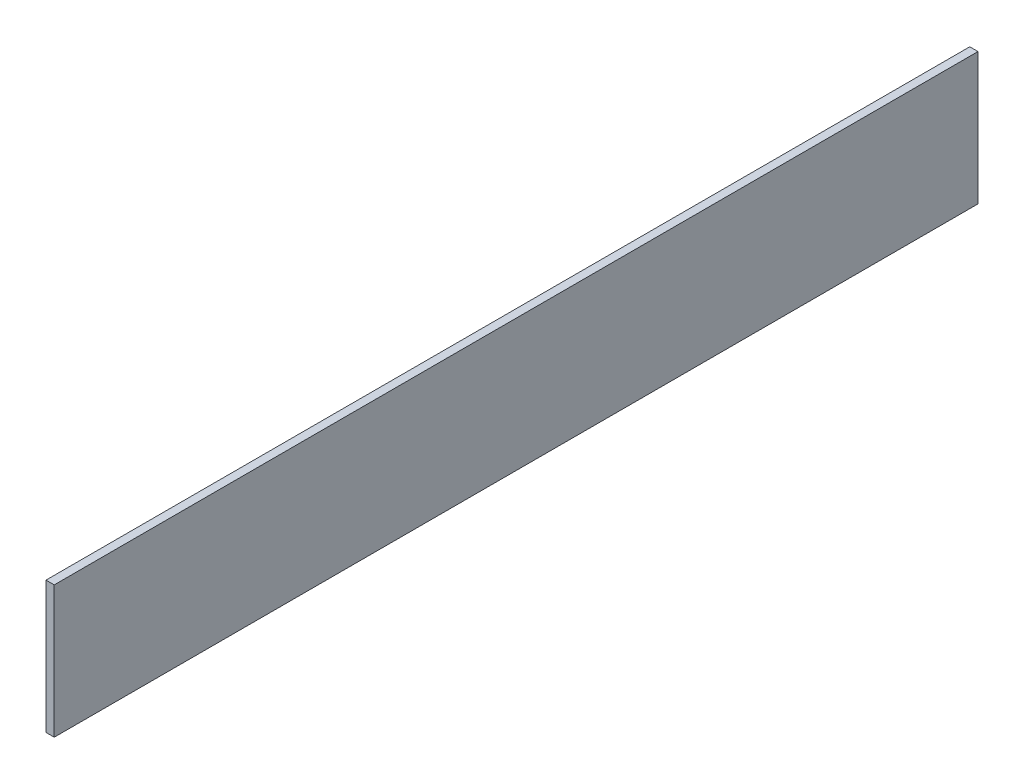
ISO-10303-21;
HEADER;
FILE_DESCRIPTION(('STEP AP214'),'2;1');
FILE_NAME('part.step','',(''),(''),'','','');
FILE_SCHEMA(('AUTOMOTIVE_DESIGN { 1 0 10303 214 1 1 1 1 }'));
ENDSEC;
DATA;
#1=APPLICATION_CONTEXT('core data for automotive mechanical design processes');
#2=APPLICATION_PROTOCOL_DEFINITION('international standard','automotive_design',2000,#1);
#3=PRODUCT_CONTEXT('',#1,'mechanical');
#4=PRODUCT('Part','Part','',(#3));
#5=PRODUCT_RELATED_PRODUCT_CATEGORY('part','',(#4));
#6=PRODUCT_DEFINITION_FORMATION('','',#4);
#7=PRODUCT_DEFINITION_CONTEXT('part definition',#1,'design');
#8=PRODUCT_DEFINITION('design','',#6,#7);
#9=PRODUCT_DEFINITION_SHAPE('','',#8);
#10=(LENGTH_UNIT() NAMED_UNIT(*) SI_UNIT(.MILLI.,.METRE.));
#11=(NAMED_UNIT(*) PLANE_ANGLE_UNIT() SI_UNIT($,.RADIAN.));
#12=(NAMED_UNIT(*) SI_UNIT($,.STERADIAN.) SOLID_ANGLE_UNIT());
#13=UNCERTAINTY_MEASURE_WITH_UNIT(LENGTH_MEASURE(1.E-05),#10,'distance_accuracy_value','');
#14=(GEOMETRIC_REPRESENTATION_CONTEXT(3) GLOBAL_UNCERTAINTY_ASSIGNED_CONTEXT((#13)) GLOBAL_UNIT_ASSIGNED_CONTEXT((#10,
#11,#12)) REPRESENTATION_CONTEXT('',''));
#15=CARTESIAN_POINT('',(0.,0.,0.));
#16=DIRECTION('',(0.,0.,1.));
#17=DIRECTION('',(1.,0.,0.));
#18=AXIS2_PLACEMENT_3D('',#15,#16,#17);
#19=CARTESIAN_POINT('',(4.7625,111.424947400933,248.712789474037));
#20=DIRECTION('',(0.,0.,-1.));
#21=DIRECTION('',(-1.,0.,0.));
#22=AXIS2_PLACEMENT_3D('',#19,#20,#21);
#23=PLANE('',#22);
#24=DIRECTION('',(0.,-1.,0.));
#25=VECTOR('',#24,1.);
#26=CARTESIAN_POINT('',(0.,111.424947400933,248.712789474037));
#27=LINE('',#26,#25);
#28=CARTESIAN_POINT('',(0.,187.624947400933,248.712789474037));
#29=VERTEX_POINT('',#28);
#30=CARTESIAN_POINT('',(0.,111.424947400933,248.712789474037));
#31=VERTEX_POINT('',#30);
#32=EDGE_CURVE('E96',#29,#31,#27,.T.);
#33=ORIENTED_EDGE('',*,*,#32,.T.);
#34=DIRECTION('',(-1.,0.,0.));
#35=VECTOR('',#34,1.);
#36=CARTESIAN_POINT('',(4.7625,111.424947400933,248.712789474037));
#37=LINE('',#36,#35);
#38=CARTESIAN_POINT('',(4.7625,111.424947400933,248.712789474037));
#39=VERTEX_POINT('',#38);
#40=EDGE_CURVE('E11',#39,#31,#37,.T.);
#41=ORIENTED_EDGE('',*,*,#40,.F.);
#42=DIRECTION('',(0.,-1.,0.));
#43=VECTOR('',#42,1.);
#44=CARTESIAN_POINT('',(4.7625,111.424947400933,248.712789474037));
#45=LINE('',#44,#43);
#46=CARTESIAN_POINT('',(4.7625,187.624947400933,248.712789474037));
#47=VERTEX_POINT('',#46);
#48=EDGE_CURVE('E84',#47,#39,#45,.T.);
#49=ORIENTED_EDGE('',*,*,#48,.F.);
#50=DIRECTION('',(-1.,0.,0.));
#51=VECTOR('',#50,1.);
#52=CARTESIAN_POINT('',(4.7625,187.624947400933,248.712789474037));
#53=LINE('',#52,#51);
#54=EDGE_CURVE('E92',#47,#29,#53,.T.);
#55=ORIENTED_EDGE('',*,*,#54,.T.);
#56=EDGE_LOOP('',(#33,#41,#49,#55));
#57=FACE_BOUND('',#56,.T.);
#58=ADVANCED_FACE('F33',(#57),#23,.F.);
#59=CARTESIAN_POINT('',(4.7625,111.424947400933,248.712789474037));
#60=DIRECTION('',(0.,1.,0.));
#61=DIRECTION('',(0.,0.,1.));
#62=AXIS2_PLACEMENT_3D('',#59,#60,#61);
#63=PLANE('',#62);
#64=DIRECTION('',(0.,0.,-1.));
#65=VECTOR('',#64,1.);
#66=CARTESIAN_POINT('',(0.,111.424947400933,248.712789474037));
#67=LINE('',#66,#65);
#68=CARTESIAN_POINT('',(0.,111.424947400933,-284.687210525963));
#69=VERTEX_POINT('',#68);
#70=EDGE_CURVE('E88',#31,#69,#67,.T.);
#71=ORIENTED_EDGE('',*,*,#70,.T.);
#72=DIRECTION('',(-1.,0.,0.));
#73=VECTOR('',#72,1.);
#74=CARTESIAN_POINT('',(4.7625,111.424947400933,-284.687210525963));
#75=LINE('',#74,#73);
#76=CARTESIAN_POINT('',(4.7625,111.424947400933,-284.687210525963));
#77=VERTEX_POINT('',#76);
#78=EDGE_CURVE('E41',#77,#69,#75,.T.);
#79=ORIENTED_EDGE('',*,*,#78,.F.);
#80=DIRECTION('',(0.,0.,-1.));
#81=VECTOR('',#80,1.);
#82=CARTESIAN_POINT('',(4.7625,111.424947400933,248.712789474037));
#83=LINE('',#82,#81);
#84=EDGE_CURVE('E79',#39,#77,#83,.T.);
#85=ORIENTED_EDGE('',*,*,#84,.F.);
#86=ORIENTED_EDGE('',*,*,#40,.T.);
#87=EDGE_LOOP('',(#71,#79,#85,#86));
#88=FACE_BOUND('',#87,.T.);
#89=ADVANCED_FACE('F87',(#88),#63,.F.);
#90=CARTESIAN_POINT('',(4.7625,111.424947400933,-284.687210525963));
#91=DIRECTION('',(0.,0.,1.));
#92=DIRECTION('',(1.,0.,0.));
#93=AXIS2_PLACEMENT_3D('',#90,#91,#92);
#94=PLANE('',#93);
#95=DIRECTION('',(0.,1.,0.));
#96=VECTOR('',#95,1.);
#97=CARTESIAN_POINT('',(0.,111.424947400933,-284.687210525963));
#98=LINE('',#97,#96);
#99=CARTESIAN_POINT('',(0.,187.624947400933,-284.687210525963));
#100=VERTEX_POINT('',#99);
#101=EDGE_CURVE('E66',#69,#100,#98,.T.);
#102=ORIENTED_EDGE('',*,*,#101,.T.);
#103=DIRECTION('',(-1.,0.,0.));
#104=VECTOR('',#103,1.);
#105=CARTESIAN_POINT('',(4.7625,187.624947400933,-284.687210525963));
#106=LINE('',#105,#104);
#107=CARTESIAN_POINT('',(4.7625,187.624947400933,-284.687210525963));
#108=VERTEX_POINT('',#107);
#109=EDGE_CURVE('E89',#108,#100,#106,.T.);
#110=ORIENTED_EDGE('',*,*,#109,.F.);
#111=DIRECTION('',(0.,1.,0.));
#112=VECTOR('',#111,1.);
#113=CARTESIAN_POINT('',(4.7625,111.424947400933,-284.687210525963));
#114=LINE('',#113,#112);
#115=EDGE_CURVE('E82',#77,#108,#114,.T.);
#116=ORIENTED_EDGE('',*,*,#115,.F.);
#117=ORIENTED_EDGE('',*,*,#78,.T.);
#118=EDGE_LOOP('',(#102,#110,#116,#117));
#119=FACE_BOUND('',#118,.T.);
#120=ADVANCED_FACE('F90',(#119),#94,.F.);
#121=CARTESIAN_POINT('',(4.7625,187.624947400933,248.712789474037));
#122=DIRECTION('',(0.,-1.,0.));
#123=DIRECTION('',(0.,0.,-1.));
#124=AXIS2_PLACEMENT_3D('',#121,#122,#123);
#125=PLANE('',#124);
#126=DIRECTION('',(0.,0.,1.));
#127=VECTOR('',#126,1.);
#128=CARTESIAN_POINT('',(0.,187.624947400933,248.712789474037));
#129=LINE('',#128,#127);
#130=EDGE_CURVE('E72',#100,#29,#129,.T.);
#131=ORIENTED_EDGE('',*,*,#130,.T.);
#132=ORIENTED_EDGE('',*,*,#54,.F.);
#133=DIRECTION('',(0.,0.,1.));
#134=VECTOR('',#133,1.);
#135=CARTESIAN_POINT('',(4.7625,187.624947400933,248.712789474037));
#136=LINE('',#135,#134);
#137=EDGE_CURVE('E49',#108,#47,#136,.T.);
#138=ORIENTED_EDGE('',*,*,#137,.F.);
#139=ORIENTED_EDGE('',*,*,#109,.T.);
#140=EDGE_LOOP('',(#131,#132,#138,#139));
#141=FACE_BOUND('',#140,.T.);
#142=ADVANCED_FACE('F103',(#141),#125,.F.);
#143=CARTESIAN_POINT('',(4.7625,0.,0.));
#144=DIRECTION('',(-1.,0.,0.));
#145=DIRECTION('',(0.,0.,1.));
#146=AXIS2_PLACEMENT_3D('',#143,#144,#145);
#147=PLANE('',#146);
#148=ORIENTED_EDGE('',*,*,#48,.T.);
#149=ORIENTED_EDGE('',*,*,#84,.T.);
#150=ORIENTED_EDGE('',*,*,#115,.T.);
#151=ORIENTED_EDGE('',*,*,#137,.T.);
#152=EDGE_LOOP('',(#148,#149,#150,#151));
#153=FACE_BOUND('',#152,.T.);
#154=ADVANCED_FACE('F80',(#153),#147,.F.);
#155=CARTESIAN_POINT('',(0.,0.,0.));
#156=DIRECTION('',(-1.,0.,0.));
#157=DIRECTION('',(0.,0.,1.));
#158=AXIS2_PLACEMENT_3D('',#155,#156,#157);
#159=PLANE('',#158);
#160=ORIENTED_EDGE('',*,*,#32,.F.);
#161=ORIENTED_EDGE('',*,*,#130,.F.);
#162=ORIENTED_EDGE('',*,*,#101,.F.);
#163=ORIENTED_EDGE('',*,*,#70,.F.);
#164=EDGE_LOOP('',(#160,#161,#162,#163));
#165=FACE_BOUND('',#164,.T.);
#166=ADVANCED_FACE('F106',(#165),#159,.T.);
#167=CLOSED_SHELL('',(#58,#89,#120,#142,#154,#166));
#168=MANIFOLD_SOLID_BREP('B2',#167);
#169=ADVANCED_BREP_SHAPE_REPRESENTATION('',(#18,#168),#14);
#170=SHAPE_DEFINITION_REPRESENTATION(#9,#169);
ENDSEC;
END-ISO-10303-21;
